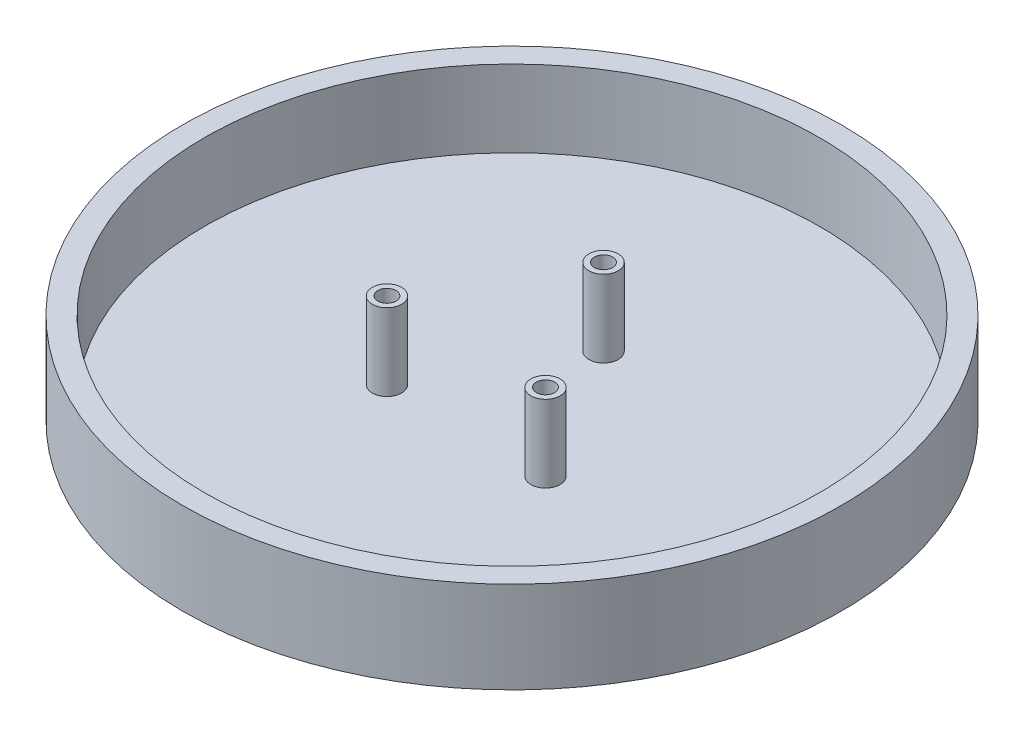
ISO-10303-21;
HEADER;
FILE_DESCRIPTION(('STEP AP214'),'2;1');
FILE_NAME('part.step','',(''),(''),'','','');
FILE_SCHEMA(('AUTOMOTIVE_DESIGN { 1 0 10303 214 1 1 1 1 }'));
ENDSEC;
DATA;
#1=APPLICATION_CONTEXT('core data for automotive mechanical design processes');
#2=APPLICATION_PROTOCOL_DEFINITION('international standard','automotive_design',2000,#1);
#3=PRODUCT_CONTEXT('',#1,'mechanical');
#4=PRODUCT('Part','Part','',(#3));
#5=PRODUCT_RELATED_PRODUCT_CATEGORY('part','',(#4));
#6=PRODUCT_DEFINITION_FORMATION('','',#4);
#7=PRODUCT_DEFINITION_CONTEXT('part definition',#1,'design');
#8=PRODUCT_DEFINITION('design','',#6,#7);
#9=PRODUCT_DEFINITION_SHAPE('','',#8);
#10=(LENGTH_UNIT() NAMED_UNIT(*) SI_UNIT(.MILLI.,.METRE.));
#11=(NAMED_UNIT(*) PLANE_ANGLE_UNIT() SI_UNIT($,.RADIAN.));
#12=(NAMED_UNIT(*) SI_UNIT($,.STERADIAN.) SOLID_ANGLE_UNIT());
#13=UNCERTAINTY_MEASURE_WITH_UNIT(LENGTH_MEASURE(1.E-05),#10,'distance_accuracy_value','');
#14=(GEOMETRIC_REPRESENTATION_CONTEXT(3) GLOBAL_UNCERTAINTY_ASSIGNED_CONTEXT((#13)) GLOBAL_UNIT_ASSIGNED_CONTEXT((#10,
#11,#12)) REPRESENTATION_CONTEXT('',''));
#15=CARTESIAN_POINT('',(0.,0.,0.));
#16=DIRECTION('',(0.,0.,1.));
#17=DIRECTION('',(1.,0.,0.));
#18=AXIS2_PLACEMENT_3D('',#15,#16,#17);
#19=CARTESIAN_POINT('',(0.,2.,-12.5));
#20=DIRECTION('',(0.,-1.,0.));
#21=DIRECTION('',(0.,0.,-1.));
#22=AXIS2_PLACEMENT_3D('',#19,#20,#21);
#23=CYLINDRICAL_SURFACE('',#22,0.8);
#24=CARTESIAN_POINT('',(0.,2.,-12.5));
#25=DIRECTION('',(0.,1.,0.));
#26=DIRECTION('',(0.,0.,1.));
#27=AXIS2_PLACEMENT_3D('',#24,#25,#26);
#28=CIRCLE('',#27,0.8);
#29=CARTESIAN_POINT('',(0.,2.,-11.7));
#30=VERTEX_POINT('',#29);
#31=EDGE_CURVE('E121',#30,#30,#28,.T.);
#32=ORIENTED_EDGE('',*,*,#31,.T.);
#33=EDGE_LOOP('',(#32));
#34=FACE_BOUND('',#33,.T.);
#35=CARTESIAN_POINT('',(0.,0.,-12.5));
#36=DIRECTION('',(0.,1.,0.));
#37=DIRECTION('',(0.,0.,1.));
#38=AXIS2_PLACEMENT_3D('',#35,#36,#37);
#39=CIRCLE('',#38,0.8);
#40=CARTESIAN_POINT('',(0.,0.,-11.7));
#41=VERTEX_POINT('',#40);
#42=EDGE_CURVE('E127',#41,#41,#39,.T.);
#43=ORIENTED_EDGE('',*,*,#42,.F.);
#44=EDGE_LOOP('',(#43));
#45=FACE_BOUND('',#44,.T.);
#46=ADVANCED_FACE('F114',(#34,#45),#23,.F.);
#47=CARTESIAN_POINT('',(0.,2.,-12.5));
#48=DIRECTION('',(0.,-1.,0.));
#49=DIRECTION('',(0.,0.,-1.));
#50=AXIS2_PLACEMENT_3D('',#47,#48,#49);
#51=CYLINDRICAL_SURFACE('',#50,1.25);
#52=CARTESIAN_POINT('',(0.,2.,-12.5));
#53=DIRECTION('',(0.,1.,0.));
#54=DIRECTION('',(0.,0.,1.));
#55=AXIS2_PLACEMENT_3D('',#52,#53,#54);
#56=CIRCLE('',#55,1.25);
#57=CARTESIAN_POINT('',(0.,2.,-11.25));
#58=VERTEX_POINT('',#57);
#59=EDGE_CURVE('E12',#58,#58,#56,.T.);
#60=ORIENTED_EDGE('',*,*,#59,.F.);
#61=EDGE_LOOP('',(#60));
#62=FACE_BOUND('',#61,.T.);
#63=CARTESIAN_POINT('',(0.,0.,-12.5));
#64=DIRECTION('',(0.,1.,0.));
#65=DIRECTION('',(0.,0.,1.));
#66=AXIS2_PLACEMENT_3D('',#63,#64,#65);
#67=CIRCLE('',#66,1.25);
#68=CARTESIAN_POINT('',(0.,0.,-11.25));
#69=VERTEX_POINT('',#68);
#70=EDGE_CURVE('E117',#69,#69,#67,.T.);
#71=ORIENTED_EDGE('',*,*,#70,.T.);
#72=EDGE_LOOP('',(#71));
#73=FACE_BOUND('',#72,.T.);
#74=ADVANCED_FACE('F134',(#62,#73),#51,.T.);
#75=CARTESIAN_POINT('',(0.,2.,0.));
#76=DIRECTION('',(0.,1.,0.));
#77=DIRECTION('',(0.,0.,1.));
#78=AXIS2_PLACEMENT_3D('',#75,#76,#77);
#79=PLANE('',#78);
#80=ORIENTED_EDGE('',*,*,#31,.F.);
#81=EDGE_LOOP('',(#80));
#82=FACE_BOUND('',#81,.T.);
#83=ORIENTED_EDGE('',*,*,#59,.T.);
#84=EDGE_LOOP('',(#83));
#85=FACE_BOUND('',#84,.T.);
#86=ADVANCED_FACE('F138',(#82,#85),#79,.T.);
#87=CARTESIAN_POINT('',(0.,0.,0.));
#88=DIRECTION('',(0.,1.,0.));
#89=DIRECTION('',(0.,0.,1.));
#90=AXIS2_PLACEMENT_3D('',#87,#88,#89);
#91=PLANE('',#90);
#92=ORIENTED_EDGE('',*,*,#42,.T.);
#93=EDGE_LOOP('',(#92));
#94=FACE_BOUND('',#93,.T.);
#95=ORIENTED_EDGE('',*,*,#70,.F.);
#96=EDGE_LOOP('',(#95));
#97=FACE_BOUND('',#96,.T.);
#98=ADVANCED_FACE('F136',(#94,#97),#91,.F.);
#99=CLOSED_SHELL('',(#46,#74,#86,#98));
#100=MANIFOLD_SOLID_BREP('B2_NOT_SHOWN',#99);
#101=CARTESIAN_POINT('',(10.8253175473073,2.,6.24999999999892));
#102=DIRECTION('',(0.,-1.,0.));
#103=DIRECTION('',(0.,0.,-1.));
#104=AXIS2_PLACEMENT_3D('',#101,#102,#103);
#105=CYLINDRICAL_SURFACE('',#104,0.800000000001526);
#106=CARTESIAN_POINT('',(10.8253175473073,2.,6.24999999999892));
#107=DIRECTION('',(0.,1.,0.));
#108=DIRECTION('',(0.,0.,1.));
#109=AXIS2_PLACEMENT_3D('',#106,#107,#108);
#110=CIRCLE('',#109,0.800000000001526);
#111=CARTESIAN_POINT('',(10.8253175473073,2.,7.05000000000045));
#112=VERTEX_POINT('',#111);
#113=EDGE_CURVE('E191',#112,#112,#110,.T.);
#114=ORIENTED_EDGE('',*,*,#113,.T.);
#115=EDGE_LOOP('',(#114));
#116=FACE_BOUND('',#115,.T.);
#117=CARTESIAN_POINT('',(10.8253175473073,0.,6.24999999999892));
#118=DIRECTION('',(0.,1.,0.));
#119=DIRECTION('',(0.,0.,1.));
#120=AXIS2_PLACEMENT_3D('',#117,#118,#119);
#121=CIRCLE('',#120,0.800000000001526);
#122=CARTESIAN_POINT('',(10.8253175473073,0.,7.05000000000045));
#123=VERTEX_POINT('',#122);
#124=EDGE_CURVE('E197',#123,#123,#121,.T.);
#125=ORIENTED_EDGE('',*,*,#124,.F.);
#126=EDGE_LOOP('',(#125));
#127=FACE_BOUND('',#126,.T.);
#128=ADVANCED_FACE('F184',(#116,#127),#105,.F.);
#129=CARTESIAN_POINT('',(10.8253175473073,2.,6.24999999999892));
#130=DIRECTION('',(0.,-1.,0.));
#131=DIRECTION('',(0.,0.,-1.));
#132=AXIS2_PLACEMENT_3D('',#129,#130,#131);
#133=CYLINDRICAL_SURFACE('',#132,1.25000000000153);
#134=CARTESIAN_POINT('',(10.8253175473073,2.,6.24999999999892));
#135=DIRECTION('',(0.,1.,0.));
#136=DIRECTION('',(0.,0.,1.));
#137=AXIS2_PLACEMENT_3D('',#134,#135,#136);
#138=CIRCLE('',#137,1.25000000000153);
#139=CARTESIAN_POINT('',(10.8253175473073,2.,7.50000000000045));
#140=VERTEX_POINT('',#139);
#141=EDGE_CURVE('E113',#140,#140,#138,.T.);
#142=ORIENTED_EDGE('',*,*,#141,.F.);
#143=EDGE_LOOP('',(#142));
#144=FACE_BOUND('',#143,.T.);
#145=CARTESIAN_POINT('',(10.8253175473073,0.,6.24999999999892));
#146=DIRECTION('',(0.,1.,0.));
#147=DIRECTION('',(0.,0.,1.));
#148=AXIS2_PLACEMENT_3D('',#145,#146,#147);
#149=CIRCLE('',#148,1.25000000000153);
#150=CARTESIAN_POINT('',(10.8253175473073,0.,7.50000000000045));
#151=VERTEX_POINT('',#150);
#152=EDGE_CURVE('E187',#151,#151,#149,.T.);
#153=ORIENTED_EDGE('',*,*,#152,.T.);
#154=EDGE_LOOP('',(#153));
#155=FACE_BOUND('',#154,.T.);
#156=ADVANCED_FACE('F204',(#144,#155),#133,.T.);
#157=CARTESIAN_POINT('',(0.,2.,0.));
#158=DIRECTION('',(0.,1.,0.));
#159=DIRECTION('',(0.,0.,1.));
#160=AXIS2_PLACEMENT_3D('',#157,#158,#159);
#161=PLANE('',#160);
#162=ORIENTED_EDGE('',*,*,#113,.F.);
#163=EDGE_LOOP('',(#162));
#164=FACE_BOUND('',#163,.T.);
#165=ORIENTED_EDGE('',*,*,#141,.T.);
#166=EDGE_LOOP('',(#165));
#167=FACE_BOUND('',#166,.T.);
#168=ADVANCED_FACE('F208',(#164,#167),#161,.T.);
#169=CARTESIAN_POINT('',(0.,0.,0.));
#170=DIRECTION('',(0.,1.,0.));
#171=DIRECTION('',(0.,0.,1.));
#172=AXIS2_PLACEMENT_3D('',#169,#170,#171);
#173=PLANE('',#172);
#174=ORIENTED_EDGE('',*,*,#124,.T.);
#175=EDGE_LOOP('',(#174));
#176=FACE_BOUND('',#175,.T.);
#177=ORIENTED_EDGE('',*,*,#152,.F.);
#178=EDGE_LOOP('',(#177));
#179=FACE_BOUND('',#178,.T.);
#180=ADVANCED_FACE('F206',(#176,#179),#173,.F.);
#181=CLOSED_SHELL('',(#128,#156,#168,#180));
#182=MANIFOLD_SOLID_BREP('B7_NOT_SHOWN',#181);
#183=CARTESIAN_POINT('',(-10.8253175473036,2.,6.25000000000108));
#184=DIRECTION('',(0.,-1.,0.));
#185=DIRECTION('',(0.,0.,-1.));
#186=AXIS2_PLACEMENT_3D('',#183,#184,#185);
#187=CYLINDRICAL_SURFACE('',#186,0.800000000002212);
#188=CARTESIAN_POINT('',(-10.8253175473036,2.,6.25000000000108));
#189=DIRECTION('',(0.,1.,0.));
#190=DIRECTION('',(0.,0.,1.));
#191=AXIS2_PLACEMENT_3D('',#188,#189,#190);
#192=CIRCLE('',#191,0.800000000002212);
#193=CARTESIAN_POINT('',(-10.8253175473036,2.,7.05000000000329));
#194=VERTEX_POINT('',#193);
#195=EDGE_CURVE('E260',#194,#194,#192,.T.);
#196=ORIENTED_EDGE('',*,*,#195,.T.);
#197=EDGE_LOOP('',(#196));
#198=FACE_BOUND('',#197,.T.);
#199=CARTESIAN_POINT('',(-10.8253175473036,0.,6.25000000000108));
#200=DIRECTION('',(0.,1.,0.));
#201=DIRECTION('',(0.,0.,1.));
#202=AXIS2_PLACEMENT_3D('',#199,#200,#201);
#203=CIRCLE('',#202,0.800000000002212);
#204=CARTESIAN_POINT('',(-10.8253175473036,0.,7.05000000000329));
#205=VERTEX_POINT('',#204);
#206=EDGE_CURVE('E266',#205,#205,#203,.T.);
#207=ORIENTED_EDGE('',*,*,#206,.F.);
#208=EDGE_LOOP('',(#207));
#209=FACE_BOUND('',#208,.T.);
#210=ADVANCED_FACE('F253',(#198,#209),#187,.F.);
#211=CARTESIAN_POINT('',(-10.8253175473036,2.,6.25000000000108));
#212=DIRECTION('',(0.,-1.,0.));
#213=DIRECTION('',(0.,0.,-1.));
#214=AXIS2_PLACEMENT_3D('',#211,#212,#213);
#215=CYLINDRICAL_SURFACE('',#214,1.25000000000221);
#216=CARTESIAN_POINT('',(-10.8253175473036,2.,6.25000000000108));
#217=DIRECTION('',(0.,1.,0.));
#218=DIRECTION('',(0.,0.,1.));
#219=AXIS2_PLACEMENT_3D('',#216,#217,#218);
#220=CIRCLE('',#219,1.25000000000221);
#221=CARTESIAN_POINT('',(-10.8253175473036,2.,7.50000000000329));
#222=VERTEX_POINT('',#221);
#223=EDGE_CURVE('E183',#222,#222,#220,.T.);
#224=ORIENTED_EDGE('',*,*,#223,.F.);
#225=EDGE_LOOP('',(#224));
#226=FACE_BOUND('',#225,.T.);
#227=CARTESIAN_POINT('',(-10.8253175473036,0.,6.25000000000108));
#228=DIRECTION('',(0.,1.,0.));
#229=DIRECTION('',(0.,0.,1.));
#230=AXIS2_PLACEMENT_3D('',#227,#228,#229);
#231=CIRCLE('',#230,1.25000000000221);
#232=CARTESIAN_POINT('',(-10.8253175473036,0.,7.50000000000329));
#233=VERTEX_POINT('',#232);
#234=EDGE_CURVE('E256',#233,#233,#231,.T.);
#235=ORIENTED_EDGE('',*,*,#234,.T.);
#236=EDGE_LOOP('',(#235));
#237=FACE_BOUND('',#236,.T.);
#238=ADVANCED_FACE('F273',(#226,#237),#215,.T.);
#239=CARTESIAN_POINT('',(0.,2.,0.));
#240=DIRECTION('',(0.,1.,0.));
#241=DIRECTION('',(0.,0.,1.));
#242=AXIS2_PLACEMENT_3D('',#239,#240,#241);
#243=PLANE('',#242);
#244=ORIENTED_EDGE('',*,*,#195,.F.);
#245=EDGE_LOOP('',(#244));
#246=FACE_BOUND('',#245,.T.);
#247=ORIENTED_EDGE('',*,*,#223,.T.);
#248=EDGE_LOOP('',(#247));
#249=FACE_BOUND('',#248,.T.);
#250=ADVANCED_FACE('F277',(#246,#249),#243,.T.);
#251=CARTESIAN_POINT('',(0.,0.,0.));
#252=DIRECTION('',(0.,1.,0.));
#253=DIRECTION('',(0.,0.,1.));
#254=AXIS2_PLACEMENT_3D('',#251,#252,#253);
#255=PLANE('',#254);
#256=ORIENTED_EDGE('',*,*,#206,.T.);
#257=EDGE_LOOP('',(#256));
#258=FACE_BOUND('',#257,.T.);
#259=ORIENTED_EDGE('',*,*,#234,.F.);
#260=EDGE_LOOP('',(#259));
#261=FACE_BOUND('',#260,.T.);
#262=ADVANCED_FACE('F275',(#258,#261),#255,.F.);
#263=CLOSED_SHELL('',(#210,#238,#250,#262));
#264=MANIFOLD_SOLID_BREP('B108_NOT_SHOWN',#263);
#265=CARTESIAN_POINT('',(0.,2.,0.));
#266=DIRECTION('',(0.,1.,0.));
#267=DIRECTION('',(0.,0.,1.));
#268=AXIS2_PLACEMENT_3D('',#265,#266,#267);
#269=PLANE('',#268);
#270=CARTESIAN_POINT('',(0.,2.,-12.5));
#271=DIRECTION('',(0.,1.,0.));
#272=DIRECTION('',(0.,0.,1.));
#273=AXIS2_PLACEMENT_3D('',#270,#271,#272);
#274=CIRCLE('',#273,2.);
#275=CARTESIAN_POINT('',(0.,2.,-10.5));
#276=VERTEX_POINT('',#275);
#277=EDGE_CURVE('E326',#276,#276,#274,.T.);
#278=ORIENTED_EDGE('',*,*,#277,.F.);
#279=EDGE_LOOP('',(#278));
#280=FACE_BOUND('',#279,.T.);
#281=CARTESIAN_POINT('',(-10.8253175473036,2.,6.25000000000108));
#282=DIRECTION('',(0.,1.,0.));
#283=DIRECTION('',(0.,0.,1.));
#284=AXIS2_PLACEMENT_3D('',#281,#282,#283);
#285=CIRCLE('',#284,2.00000000000221);
#286=CARTESIAN_POINT('',(-10.8253175473036,2.,8.25000000000329));
#287=VERTEX_POINT('',#286);
#288=EDGE_CURVE('E322',#287,#287,#285,.T.);
#289=ORIENTED_EDGE('',*,*,#288,.F.);
#290=EDGE_LOOP('',(#289));
#291=FACE_BOUND('',#290,.T.);
#292=CARTESIAN_POINT('',(10.8253175473073,2.,6.24999999999892));
#293=DIRECTION('',(0.,1.,0.));
#294=DIRECTION('',(0.,0.,1.));
#295=AXIS2_PLACEMENT_3D('',#292,#293,#294);
#296=CIRCLE('',#295,2.00000000000153);
#297=CARTESIAN_POINT('',(10.8253175473073,2.,8.25000000000045));
#298=VERTEX_POINT('',#297);
#299=EDGE_CURVE('E252',#298,#298,#296,.T.);
#300=ORIENTED_EDGE('',*,*,#299,.F.);
#301=EDGE_LOOP('',(#300));
#302=FACE_BOUND('',#301,.T.);
#303=CARTESIAN_POINT('',(0.,2.,0.));
#304=DIRECTION('',(0.,1.,0.));
#305=DIRECTION('',(0.,0.,1.));
#306=AXIS2_PLACEMENT_3D('',#303,#304,#305);
#307=CIRCLE('',#306,42.);
#308=CARTESIAN_POINT('',(0.,2.,42.));
#309=VERTEX_POINT('',#308);
#310=EDGE_CURVE('E330',#309,#309,#307,.F.);
#311=ORIENTED_EDGE('',*,*,#310,.F.);
#312=EDGE_LOOP('',(#311));
#313=FACE_BOUND('',#312,.T.);
#314=ADVANCED_FACE('F315',(#280,#291,#302,#313),#269,.T.);
#315=CARTESIAN_POINT('',(0.,0.,0.));
#316=DIRECTION('',(0.,1.,0.));
#317=DIRECTION('',(0.,0.,1.));
#318=AXIS2_PLACEMENT_3D('',#315,#316,#317);
#319=PLANE('',#318);
#320=CARTESIAN_POINT('',(0.,0.,0.));
#321=DIRECTION('',(0.,1.,0.));
#322=DIRECTION('',(0.,0.,1.));
#323=AXIS2_PLACEMENT_3D('',#320,#321,#322);
#324=CIRCLE('',#323,45.);
#325=CARTESIAN_POINT('',(0.,0.,45.));
#326=VERTEX_POINT('',#325);
#327=EDGE_CURVE('E336',#326,#326,#324,.T.);
#328=ORIENTED_EDGE('',*,*,#327,.F.);
#329=EDGE_LOOP('',(#328));
#330=FACE_BOUND('',#329,.T.);
#331=CARTESIAN_POINT('',(10.8253175473073,0.,6.24999999999892));
#332=DIRECTION('',(0.,1.,0.));
#333=DIRECTION('',(0.,0.,1.));
#334=AXIS2_PLACEMENT_3D('',#331,#332,#333);
#335=CIRCLE('',#334,1.25000000000153);
#336=CARTESIAN_POINT('',(10.8253175473073,0.,7.50000000000045));
#337=VERTEX_POINT('',#336);
#338=EDGE_CURVE('E340',#337,#337,#335,.T.);
#339=ORIENTED_EDGE('',*,*,#338,.T.);
#340=EDGE_LOOP('',(#339));
#341=FACE_BOUND('',#340,.T.);
#342=CARTESIAN_POINT('',(-10.8253175473036,0.,6.25000000000108));
#343=DIRECTION('',(0.,1.,0.));
#344=DIRECTION('',(0.,0.,1.));
#345=AXIS2_PLACEMENT_3D('',#342,#343,#344);
#346=CIRCLE('',#345,1.25000000000221);
#347=CARTESIAN_POINT('',(-10.8253175473036,0.,7.50000000000329));
#348=VERTEX_POINT('',#347);
#349=EDGE_CURVE('E353',#348,#348,#346,.T.);
#350=ORIENTED_EDGE('',*,*,#349,.T.);
#351=EDGE_LOOP('',(#350));
#352=FACE_BOUND('',#351,.T.);
#353=CARTESIAN_POINT('',(0.,0.,-12.5));
#354=DIRECTION('',(0.,1.,0.));
#355=DIRECTION('',(0.,0.,1.));
#356=AXIS2_PLACEMENT_3D('',#353,#354,#355);
#357=CIRCLE('',#356,1.25);
#358=CARTESIAN_POINT('',(0.,0.,-11.25));
#359=VERTEX_POINT('',#358);
#360=EDGE_CURVE('E362',#359,#359,#357,.T.);
#361=ORIENTED_EDGE('',*,*,#360,.T.);
#362=EDGE_LOOP('',(#361));
#363=FACE_BOUND('',#362,.T.);
#364=ADVANCED_FACE('F317',(#330,#341,#352,#363),#319,.F.);
#365=CARTESIAN_POINT('',(0.,12.5,0.));
#366=DIRECTION('',(0.,-1.,0.));
#367=DIRECTION('',(0.,0.,-1.));
#368=AXIS2_PLACEMENT_3D('',#365,#366,#367);
#369=CYLINDRICAL_SURFACE('',#368,42.);
#370=ORIENTED_EDGE('',*,*,#310,.T.);
#371=EDGE_LOOP('',(#370));
#372=FACE_BOUND('',#371,.T.);
#373=CARTESIAN_POINT('',(0.,12.5,0.));
#374=DIRECTION('',(0.,1.,0.));
#375=DIRECTION('',(0.,0.,1.));
#376=AXIS2_PLACEMENT_3D('',#373,#374,#375);
#377=CIRCLE('',#376,42.);
#378=CARTESIAN_POINT('',(0.,12.5,42.));
#379=VERTEX_POINT('',#378);
#380=EDGE_CURVE('E339',#379,#379,#377,.T.);
#381=ORIENTED_EDGE('',*,*,#380,.T.);
#382=EDGE_LOOP('',(#381));
#383=FACE_BOUND('',#382,.T.);
#384=ADVANCED_FACE('F393',(#372,#383),#369,.F.);
#385=CARTESIAN_POINT('',(0.,12.5,0.));
#386=DIRECTION('',(0.,-1.,0.));
#387=DIRECTION('',(0.,0.,-1.));
#388=AXIS2_PLACEMENT_3D('',#385,#386,#387);
#389=CYLINDRICAL_SURFACE('',#388,45.);
#390=CARTESIAN_POINT('',(0.,12.5,0.));
#391=DIRECTION('',(0.,1.,0.));
#392=DIRECTION('',(0.,0.,1.));
#393=AXIS2_PLACEMENT_3D('',#390,#391,#392);
#394=CIRCLE('',#393,45.);
#395=CARTESIAN_POINT('',(0.,12.5,45.));
#396=VERTEX_POINT('',#395);
#397=EDGE_CURVE('E335',#396,#396,#394,.T.);
#398=ORIENTED_EDGE('',*,*,#397,.F.);
#399=EDGE_LOOP('',(#398));
#400=FACE_BOUND('',#399,.T.);
#401=ORIENTED_EDGE('',*,*,#327,.T.);
#402=EDGE_LOOP('',(#401));
#403=FACE_BOUND('',#402,.T.);
#404=ADVANCED_FACE('F400',(#400,#403),#389,.T.);
#405=CARTESIAN_POINT('',(0.,12.5,0.));
#406=DIRECTION('',(0.,1.,0.));
#407=DIRECTION('',(0.,0.,1.));
#408=AXIS2_PLACEMENT_3D('',#405,#406,#407);
#409=PLANE('',#408);
#410=ORIENTED_EDGE('',*,*,#380,.F.);
#411=EDGE_LOOP('',(#410));
#412=FACE_BOUND('',#411,.T.);
#413=ORIENTED_EDGE('',*,*,#397,.T.);
#414=EDGE_LOOP('',(#413));
#415=FACE_BOUND('',#414,.T.);
#416=ADVANCED_FACE('F404',(#412,#415),#409,.T.);
#417=CARTESIAN_POINT('',(10.8253175473073,12.5,6.24999999999892));
#418=DIRECTION('',(0.,1.,0.));
#419=DIRECTION('',(0.,0.,1.));
#420=AXIS2_PLACEMENT_3D('',#417,#418,#419);
#421=PLANE('',#420);
#422=CARTESIAN_POINT('',(10.8253175473073,12.5,6.24999999999892));
#423=DIRECTION('',(0.,1.,0.));
#424=DIRECTION('',(0.,0.,1.));
#425=AXIS2_PLACEMENT_3D('',#422,#423,#424);
#426=CIRCLE('',#425,2.00000000000153);
#427=CARTESIAN_POINT('',(10.8253175473073,12.5,8.25000000000045));
#428=VERTEX_POINT('',#427);
#429=EDGE_CURVE('E348',#428,#428,#426,.T.);
#430=ORIENTED_EDGE('',*,*,#429,.T.);
#431=EDGE_LOOP('',(#430));
#432=FACE_BOUND('',#431,.T.);
#433=CARTESIAN_POINT('',(10.8253175473073,12.5,6.24999999999892));
#434=DIRECTION('',(0.,1.,0.));
#435=DIRECTION('',(0.,0.,1.));
#436=AXIS2_PLACEMENT_3D('',#433,#434,#435);
#437=CIRCLE('',#436,1.25000000000153);
#438=CARTESIAN_POINT('',(10.8253175473073,12.5,7.50000000000045));
#439=VERTEX_POINT('',#438);
#440=EDGE_CURVE('E345',#439,#439,#437,.T.);
#441=ORIENTED_EDGE('',*,*,#440,.F.);
#442=EDGE_LOOP('',(#441));
#443=FACE_BOUND('',#442,.T.);
#444=ADVANCED_FACE('F408',(#432,#443),#421,.T.);
#445=CARTESIAN_POINT('',(10.8253175473073,12.5,6.24999999999892));
#446=DIRECTION('',(0.,-1.,0.));
#447=DIRECTION('',(0.,0.,-1.));
#448=AXIS2_PLACEMENT_3D('',#445,#446,#447);
#449=CYLINDRICAL_SURFACE('',#448,2.00000000000153);
#450=ORIENTED_EDGE('',*,*,#299,.T.);
#451=EDGE_LOOP('',(#450));
#452=FACE_BOUND('',#451,.T.);
#453=ORIENTED_EDGE('',*,*,#429,.F.);
#454=EDGE_LOOP('',(#453));
#455=FACE_BOUND('',#454,.T.);
#456=ADVANCED_FACE('F414',(#452,#455),#449,.T.);
#457=CARTESIAN_POINT('',(10.8253175473073,12.5,6.24999999999892));
#458=DIRECTION('',(0.,-1.,0.));
#459=DIRECTION('',(0.,0.,-1.));
#460=AXIS2_PLACEMENT_3D('',#457,#458,#459);
#461=CYLINDRICAL_SURFACE('',#460,1.25000000000153);
#462=ORIENTED_EDGE('',*,*,#440,.T.);
#463=EDGE_LOOP('',(#462));
#464=FACE_BOUND('',#463,.T.);
#465=ORIENTED_EDGE('',*,*,#338,.F.);
#466=EDGE_LOOP('',(#465));
#467=FACE_BOUND('',#466,.T.);
#468=ADVANCED_FACE('F410',(#464,#467),#461,.F.);
#469=CARTESIAN_POINT('',(-10.8253175473036,12.5,6.25000000000108));
#470=DIRECTION('',(0.,1.,0.));
#471=DIRECTION('',(0.,0.,1.));
#472=AXIS2_PLACEMENT_3D('',#469,#470,#471);
#473=PLANE('',#472);
#474=CARTESIAN_POINT('',(-10.8253175473036,12.5,6.25000000000108));
#475=DIRECTION('',(0.,1.,0.));
#476=DIRECTION('',(0.,0.,1.));
#477=AXIS2_PLACEMENT_3D('',#474,#475,#476);
#478=CIRCLE('',#477,2.00000000000221);
#479=CARTESIAN_POINT('',(-10.8253175473036,12.5,8.25000000000329));
#480=VERTEX_POINT('',#479);
#481=EDGE_CURVE('E357',#480,#480,#478,.T.);
#482=ORIENTED_EDGE('',*,*,#481,.T.);
#483=EDGE_LOOP('',(#482));
#484=FACE_BOUND('',#483,.T.);
#485=CARTESIAN_POINT('',(-10.8253175473036,12.5,6.25000000000108));
#486=DIRECTION('',(0.,1.,0.));
#487=DIRECTION('',(0.,0.,1.));
#488=AXIS2_PLACEMENT_3D('',#485,#486,#487);
#489=CIRCLE('',#488,1.25000000000221);
#490=CARTESIAN_POINT('',(-10.8253175473036,12.5,7.50000000000329));
#491=VERTEX_POINT('',#490);
#492=EDGE_CURVE('E354',#491,#491,#489,.T.);
#493=ORIENTED_EDGE('',*,*,#492,.F.);
#494=EDGE_LOOP('',(#493));
#495=FACE_BOUND('',#494,.T.);
#496=ADVANCED_FACE('F413',(#484,#495),#473,.T.);
#497=CARTESIAN_POINT('',(-10.8253175473036,12.5,6.25000000000108));
#498=DIRECTION('',(0.,-1.,0.));
#499=DIRECTION('',(0.,0.,-1.));
#500=AXIS2_PLACEMENT_3D('',#497,#498,#499);
#501=CYLINDRICAL_SURFACE('',#500,2.00000000000221);
#502=ORIENTED_EDGE('',*,*,#288,.T.);
#503=EDGE_LOOP('',(#502));
#504=FACE_BOUND('',#503,.T.);
#505=ORIENTED_EDGE('',*,*,#481,.F.);
#506=EDGE_LOOP('',(#505));
#507=FACE_BOUND('',#506,.T.);
#508=ADVANCED_FACE('F423',(#504,#507),#501,.T.);
#509=CARTESIAN_POINT('',(-10.8253175473036,12.5,6.25000000000108));
#510=DIRECTION('',(0.,-1.,0.));
#511=DIRECTION('',(0.,0.,-1.));
#512=AXIS2_PLACEMENT_3D('',#509,#510,#511);
#513=CYLINDRICAL_SURFACE('',#512,1.25000000000221);
#514=ORIENTED_EDGE('',*,*,#492,.T.);
#515=EDGE_LOOP('',(#514));
#516=FACE_BOUND('',#515,.T.);
#517=ORIENTED_EDGE('',*,*,#349,.F.);
#518=EDGE_LOOP('',(#517));
#519=FACE_BOUND('',#518,.T.);
#520=ADVANCED_FACE('F386',(#516,#519),#513,.F.);
#521=CARTESIAN_POINT('',(0.,12.5,-12.5));
#522=DIRECTION('',(0.,1.,0.));
#523=DIRECTION('',(0.,0.,1.));
#524=AXIS2_PLACEMENT_3D('',#521,#522,#523);
#525=PLANE('',#524);
#526=CARTESIAN_POINT('',(0.,12.5,-12.5));
#527=DIRECTION('',(0.,1.,0.));
#528=DIRECTION('',(0.,0.,1.));
#529=AXIS2_PLACEMENT_3D('',#526,#527,#528);
#530=CIRCLE('',#529,2.);
#531=CARTESIAN_POINT('',(0.,12.5,-10.5));
#532=VERTEX_POINT('',#531);
#533=EDGE_CURVE('E366',#532,#532,#530,.T.);
#534=ORIENTED_EDGE('',*,*,#533,.T.);
#535=EDGE_LOOP('',(#534));
#536=FACE_BOUND('',#535,.T.);
#537=CARTESIAN_POINT('',(0.,12.5,-12.5));
#538=DIRECTION('',(0.,1.,0.));
#539=DIRECTION('',(0.,0.,1.));
#540=AXIS2_PLACEMENT_3D('',#537,#538,#539);
#541=CIRCLE('',#540,1.25);
#542=CARTESIAN_POINT('',(0.,12.5,-11.25));
#543=VERTEX_POINT('',#542);
#544=EDGE_CURVE('E363',#543,#543,#541,.T.);
#545=ORIENTED_EDGE('',*,*,#544,.F.);
#546=EDGE_LOOP('',(#545));
#547=FACE_BOUND('',#546,.T.);
#548=ADVANCED_FACE('F372',(#536,#547),#525,.T.);
#549=CARTESIAN_POINT('',(0.,12.5,-12.5));
#550=DIRECTION('',(0.,-1.,0.));
#551=DIRECTION('',(0.,0.,-1.));
#552=AXIS2_PLACEMENT_3D('',#549,#550,#551);
#553=CYLINDRICAL_SURFACE('',#552,2.);
#554=ORIENTED_EDGE('',*,*,#277,.T.);
#555=EDGE_LOOP('',(#554));
#556=FACE_BOUND('',#555,.T.);
#557=ORIENTED_EDGE('',*,*,#533,.F.);
#558=EDGE_LOOP('',(#557));
#559=FACE_BOUND('',#558,.T.);
#560=ADVANCED_FACE('F375',(#556,#559),#553,.T.);
#561=CARTESIAN_POINT('',(0.,12.5,-12.5));
#562=DIRECTION('',(0.,-1.,0.));
#563=DIRECTION('',(0.,0.,-1.));
#564=AXIS2_PLACEMENT_3D('',#561,#562,#563);
#565=CYLINDRICAL_SURFACE('',#564,1.25);
#566=ORIENTED_EDGE('',*,*,#544,.T.);
#567=EDGE_LOOP('',(#566));
#568=FACE_BOUND('',#567,.T.);
#569=ORIENTED_EDGE('',*,*,#360,.F.);
#570=EDGE_LOOP('',(#569));
#571=FACE_BOUND('',#570,.T.);
#572=ADVANCED_FACE('F377',(#568,#571),#565,.F.);
#573=CLOSED_SHELL('',(#314,#364,#384,#404,#416,#444,#456,#468,#496,#508,#520,#548,#560,#572));
#574=MANIFOLD_SOLID_BREP('B178',#573);
#575=ADVANCED_BREP_SHAPE_REPRESENTATION('',(#18,#100,#182,#264,#574),#14);
#576=SHAPE_DEFINITION_REPRESENTATION(#9,#575);
ENDSEC;
END-ISO-10303-21;
